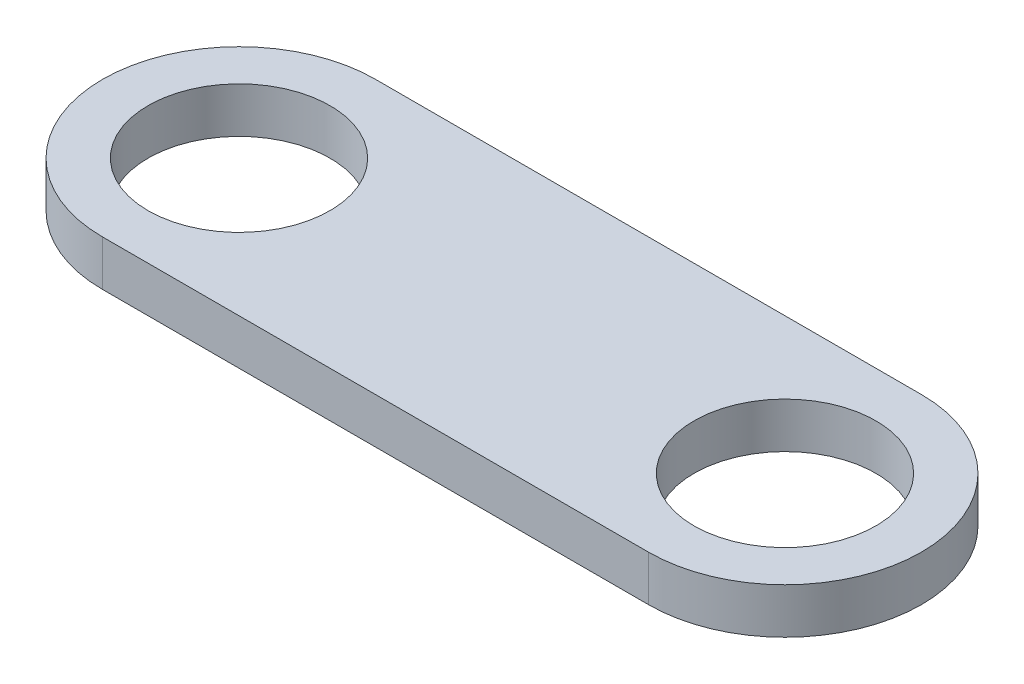
ISO-10303-21;
HEADER;
FILE_DESCRIPTION(('STEP AP214'),'2;1');
FILE_NAME('part.step','',(''),(''),'','','');
FILE_SCHEMA(('AUTOMOTIVE_DESIGN { 1 0 10303 214 1 1 1 1 }'));
ENDSEC;
DATA;
#1=APPLICATION_CONTEXT('core data for automotive mechanical design processes');
#2=APPLICATION_PROTOCOL_DEFINITION('international standard','automotive_design',2000,#1);
#3=PRODUCT_CONTEXT('',#1,'mechanical');
#4=PRODUCT('Part','Part','',(#3));
#5=PRODUCT_RELATED_PRODUCT_CATEGORY('part','',(#4));
#6=PRODUCT_DEFINITION_FORMATION('','',#4);
#7=PRODUCT_DEFINITION_CONTEXT('part definition',#1,'design');
#8=PRODUCT_DEFINITION('design','',#6,#7);
#9=PRODUCT_DEFINITION_SHAPE('','',#8);
#10=(LENGTH_UNIT() NAMED_UNIT(*) SI_UNIT(.MILLI.,.METRE.));
#11=(NAMED_UNIT(*) PLANE_ANGLE_UNIT() SI_UNIT($,.RADIAN.));
#12=(NAMED_UNIT(*) SI_UNIT($,.STERADIAN.) SOLID_ANGLE_UNIT());
#13=UNCERTAINTY_MEASURE_WITH_UNIT(LENGTH_MEASURE(1.E-05),#10,'distance_accuracy_value','');
#14=(GEOMETRIC_REPRESENTATION_CONTEXT(3) GLOBAL_UNCERTAINTY_ASSIGNED_CONTEXT((#13)) GLOBAL_UNIT_ASSIGNED_CONTEXT((#10,
#11,#12)) REPRESENTATION_CONTEXT('',''));
#15=CARTESIAN_POINT('',(0.,0.,0.));
#16=DIRECTION('',(0.,0.,1.));
#17=DIRECTION('',(1.,0.,0.));
#18=AXIS2_PLACEMENT_3D('',#15,#16,#17);
#19=CARTESIAN_POINT('',(0.,3.175,0.));
#20=DIRECTION('',(0.,1.,0.));
#21=DIRECTION('',(0.,0.,1.));
#22=AXIS2_PLACEMENT_3D('',#19,#20,#21);
#23=PLANE('',#22);
#24=CARTESIAN_POINT('',(0.,3.175,0.));
#25=DIRECTION('',(0.,1.,0.));
#26=DIRECTION('',(0.,0.,1.));
#27=AXIS2_PLACEMENT_3D('',#24,#25,#26);
#28=CIRCLE('',#27,6.35);
#29=CARTESIAN_POINT('',(0.,3.175,6.35));
#30=VERTEX_POINT('',#29);
#31=EDGE_CURVE('E100',#30,#30,#28,.T.);
#32=ORIENTED_EDGE('',*,*,#31,.F.);
#33=EDGE_LOOP('',(#32));
#34=FACE_BOUND('',#33,.T.);
#35=CARTESIAN_POINT('',(0.,3.175,0.));
#36=DIRECTION('',(0.,1.,0.));
#37=DIRECTION('',(0.,0.,1.));
#38=AXIS2_PLACEMENT_3D('',#35,#36,#37);
#39=CIRCLE('',#38,9.525);
#40=CARTESIAN_POINT('',(0.,3.175,-9.525));
#41=VERTEX_POINT('',#40);
#42=CARTESIAN_POINT('',(0.,3.175,9.525));
#43=VERTEX_POINT('',#42);
#44=EDGE_CURVE('E85',#41,#43,#39,.T.);
#45=ORIENTED_EDGE('',*,*,#44,.T.);
#46=DIRECTION('',(1.,0.,0.));
#47=VECTOR('',#46,1.);
#48=CARTESIAN_POINT('',(0.,3.175,9.525));
#49=LINE('',#48,#47);
#50=CARTESIAN_POINT('',(38.1,3.175,9.525));
#51=VERTEX_POINT('',#50);
#52=EDGE_CURVE('E80',#43,#51,#49,.T.);
#53=ORIENTED_EDGE('',*,*,#52,.T.);
#54=CARTESIAN_POINT('',(38.1,3.175,0.));
#55=DIRECTION('',(0.,1.,0.));
#56=DIRECTION('',(0.,0.,1.));
#57=AXIS2_PLACEMENT_3D('',#54,#55,#56);
#58=CIRCLE('',#57,9.525);
#59=CARTESIAN_POINT('',(38.1,3.175,-9.525));
#60=VERTEX_POINT('',#59);
#61=EDGE_CURVE('E83',#51,#60,#58,.T.);
#62=ORIENTED_EDGE('',*,*,#61,.T.);
#63=DIRECTION('',(-1.,0.,0.));
#64=VECTOR('',#63,1.);
#65=CARTESIAN_POINT('',(0.,3.175,-9.525));
#66=LINE('',#65,#64);
#67=EDGE_CURVE('E50',#60,#41,#66,.T.);
#68=ORIENTED_EDGE('',*,*,#67,.T.);
#69=EDGE_LOOP('',(#45,#53,#62,#68));
#70=FACE_BOUND('',#69,.T.);
#71=CARTESIAN_POINT('',(38.1,3.175,0.));
#72=DIRECTION('',(0.,1.,0.));
#73=DIRECTION('',(0.,0.,1.));
#74=AXIS2_PLACEMENT_3D('',#71,#72,#73);
#75=CIRCLE('',#74,6.35);
#76=CARTESIAN_POINT('',(38.1,3.175,6.35));
#77=VERTEX_POINT('',#76);
#78=EDGE_CURVE('E115',#77,#77,#75,.T.);
#79=ORIENTED_EDGE('',*,*,#78,.F.);
#80=EDGE_LOOP('',(#79));
#81=FACE_BOUND('',#80,.T.);
#82=ADVANCED_FACE('F33',(#34,#70,#81),#23,.T.);
#83=CARTESIAN_POINT('',(0.,0.,0.));
#84=DIRECTION('',(0.,1.,0.));
#85=DIRECTION('',(0.,0.,1.));
#86=AXIS2_PLACEMENT_3D('',#83,#84,#85);
#87=PLANE('',#86);
#88=CARTESIAN_POINT('',(0.,0.,0.));
#89=DIRECTION('',(0.,1.,0.));
#90=DIRECTION('',(0.,0.,1.));
#91=AXIS2_PLACEMENT_3D('',#88,#89,#90);
#92=CIRCLE('',#91,9.525);
#93=CARTESIAN_POINT('',(0.,0.,-9.525));
#94=VERTEX_POINT('',#93);
#95=CARTESIAN_POINT('',(0.,0.,9.525));
#96=VERTEX_POINT('',#95);
#97=EDGE_CURVE('E97',#94,#96,#92,.T.);
#98=ORIENTED_EDGE('',*,*,#97,.F.);
#99=DIRECTION('',(-1.,0.,0.));
#100=VECTOR('',#99,1.);
#101=CARTESIAN_POINT('',(0.,0.,-9.525));
#102=LINE('',#101,#100);
#103=CARTESIAN_POINT('',(38.1,0.,-9.525));
#104=VERTEX_POINT('',#103);
#105=EDGE_CURVE('E73',#104,#94,#102,.T.);
#106=ORIENTED_EDGE('',*,*,#105,.F.);
#107=CARTESIAN_POINT('',(38.1,0.,0.));
#108=DIRECTION('',(0.,1.,0.));
#109=DIRECTION('',(0.,0.,1.));
#110=AXIS2_PLACEMENT_3D('',#107,#108,#109);
#111=CIRCLE('',#110,9.525);
#112=CARTESIAN_POINT('',(38.1,0.,9.525));
#113=VERTEX_POINT('',#112);
#114=EDGE_CURVE('E67',#113,#104,#111,.T.);
#115=ORIENTED_EDGE('',*,*,#114,.F.);
#116=DIRECTION('',(1.,0.,0.));
#117=VECTOR('',#116,1.);
#118=CARTESIAN_POINT('',(0.,0.,9.525));
#119=LINE('',#118,#117);
#120=EDGE_CURVE('E89',#96,#113,#119,.T.);
#121=ORIENTED_EDGE('',*,*,#120,.F.);
#122=EDGE_LOOP('',(#98,#106,#115,#121));
#123=FACE_BOUND('',#122,.T.);
#124=CARTESIAN_POINT('',(0.,0.,0.));
#125=DIRECTION('',(0.,1.,0.));
#126=DIRECTION('',(0.,0.,1.));
#127=AXIS2_PLACEMENT_3D('',#124,#125,#126);
#128=CIRCLE('',#127,6.35);
#129=CARTESIAN_POINT('',(0.,0.,6.35));
#130=VERTEX_POINT('',#129);
#131=EDGE_CURVE('E112',#130,#130,#128,.T.);
#132=ORIENTED_EDGE('',*,*,#131,.T.);
#133=EDGE_LOOP('',(#132));
#134=FACE_BOUND('',#133,.T.);
#135=CARTESIAN_POINT('',(38.1,0.,0.));
#136=DIRECTION('',(0.,1.,0.));
#137=DIRECTION('',(0.,0.,1.));
#138=AXIS2_PLACEMENT_3D('',#135,#136,#137);
#139=CIRCLE('',#138,6.35);
#140=CARTESIAN_POINT('',(38.1,0.,6.35));
#141=VERTEX_POINT('',#140);
#142=EDGE_CURVE('E118',#141,#141,#139,.T.);
#143=ORIENTED_EDGE('',*,*,#142,.T.);
#144=EDGE_LOOP('',(#143));
#145=FACE_BOUND('',#144,.T.);
#146=ADVANCED_FACE('F108',(#123,#134,#145),#87,.F.);
#147=CARTESIAN_POINT('',(0.,3.175,0.));
#148=DIRECTION('',(0.,-1.,0.));
#149=DIRECTION('',(0.,0.,-1.));
#150=AXIS2_PLACEMENT_3D('',#147,#148,#149);
#151=CYLINDRICAL_SURFACE('',#150,9.525);
#152=ORIENTED_EDGE('',*,*,#97,.T.);
#153=DIRECTION('',(0.,-1.,0.));
#154=VECTOR('',#153,1.);
#155=CARTESIAN_POINT('',(0.,3.175,9.525));
#156=LINE('',#155,#154);
#157=EDGE_CURVE('E11',#43,#96,#156,.T.);
#158=ORIENTED_EDGE('',*,*,#157,.F.);
#159=ORIENTED_EDGE('',*,*,#44,.F.);
#160=DIRECTION('',(0.,-1.,0.));
#161=VECTOR('',#160,1.);
#162=CARTESIAN_POINT('',(0.,3.175,-9.525));
#163=LINE('',#162,#161);
#164=EDGE_CURVE('E93',#41,#94,#163,.T.);
#165=ORIENTED_EDGE('',*,*,#164,.T.);
#166=EDGE_LOOP('',(#152,#158,#159,#165));
#167=FACE_BOUND('',#166,.T.);
#168=ADVANCED_FACE('F35',(#167),#151,.T.);
#169=CARTESIAN_POINT('',(0.,3.175,9.525));
#170=DIRECTION('',(0.,0.,-1.));
#171=DIRECTION('',(-1.,0.,0.));
#172=AXIS2_PLACEMENT_3D('',#169,#170,#171);
#173=PLANE('',#172);
#174=ORIENTED_EDGE('',*,*,#120,.T.);
#175=DIRECTION('',(0.,-1.,0.));
#176=VECTOR('',#175,1.);
#177=CARTESIAN_POINT('',(38.1,3.175,9.525));
#178=LINE('',#177,#176);
#179=EDGE_CURVE('E42',#51,#113,#178,.T.);
#180=ORIENTED_EDGE('',*,*,#179,.F.);
#181=ORIENTED_EDGE('',*,*,#52,.F.);
#182=ORIENTED_EDGE('',*,*,#157,.T.);
#183=EDGE_LOOP('',(#174,#180,#181,#182));
#184=FACE_BOUND('',#183,.T.);
#185=ADVANCED_FACE('F88',(#184),#173,.F.);
#186=CARTESIAN_POINT('',(38.1,3.175,0.));
#187=DIRECTION('',(0.,-1.,0.));
#188=DIRECTION('',(0.,0.,-1.));
#189=AXIS2_PLACEMENT_3D('',#186,#187,#188);
#190=CYLINDRICAL_SURFACE('',#189,9.525);
#191=ORIENTED_EDGE('',*,*,#114,.T.);
#192=DIRECTION('',(0.,-1.,0.));
#193=VECTOR('',#192,1.);
#194=CARTESIAN_POINT('',(38.1,3.175,-9.525));
#195=LINE('',#194,#193);
#196=EDGE_CURVE('E90',#60,#104,#195,.T.);
#197=ORIENTED_EDGE('',*,*,#196,.F.);
#198=ORIENTED_EDGE('',*,*,#61,.F.);
#199=ORIENTED_EDGE('',*,*,#179,.T.);
#200=EDGE_LOOP('',(#191,#197,#198,#199));
#201=FACE_BOUND('',#200,.T.);
#202=ADVANCED_FACE('F91',(#201),#190,.T.);
#203=CARTESIAN_POINT('',(0.,3.175,-9.525));
#204=DIRECTION('',(0.,0.,1.));
#205=DIRECTION('',(1.,0.,0.));
#206=AXIS2_PLACEMENT_3D('',#203,#204,#205);
#207=PLANE('',#206);
#208=ORIENTED_EDGE('',*,*,#105,.T.);
#209=ORIENTED_EDGE('',*,*,#164,.F.);
#210=ORIENTED_EDGE('',*,*,#67,.F.);
#211=ORIENTED_EDGE('',*,*,#196,.T.);
#212=EDGE_LOOP('',(#208,#209,#210,#211));
#213=FACE_BOUND('',#212,.T.);
#214=ADVANCED_FACE('F105',(#213),#207,.F.);
#215=CARTESIAN_POINT('',(0.,3.175,0.));
#216=DIRECTION('',(0.,-1.,0.));
#217=DIRECTION('',(0.,0.,-1.));
#218=AXIS2_PLACEMENT_3D('',#215,#216,#217);
#219=CYLINDRICAL_SURFACE('',#218,6.35);
#220=ORIENTED_EDGE('',*,*,#31,.T.);
#221=EDGE_LOOP('',(#220));
#222=FACE_BOUND('',#221,.T.);
#223=ORIENTED_EDGE('',*,*,#131,.F.);
#224=EDGE_LOOP('',(#223));
#225=FACE_BOUND('',#224,.T.);
#226=ADVANCED_FACE('F135',(#222,#225),#219,.F.);
#227=CARTESIAN_POINT('',(38.1,3.175,0.));
#228=DIRECTION('',(0.,-1.,0.));
#229=DIRECTION('',(0.,0.,-1.));
#230=AXIS2_PLACEMENT_3D('',#227,#228,#229);
#231=CYLINDRICAL_SURFACE('',#230,6.35);
#232=ORIENTED_EDGE('',*,*,#78,.T.);
#233=EDGE_LOOP('',(#232));
#234=FACE_BOUND('',#233,.T.);
#235=ORIENTED_EDGE('',*,*,#142,.F.);
#236=EDGE_LOOP('',(#235));
#237=FACE_BOUND('',#236,.T.);
#238=ADVANCED_FACE('F124',(#234,#237),#231,.F.);
#239=CLOSED_SHELL('',(#82,#146,#168,#185,#202,#214,#226,#238));
#240=MANIFOLD_SOLID_BREP('B2',#239);
#241=ADVANCED_BREP_SHAPE_REPRESENTATION('',(#18,#240),#14);
#242=SHAPE_DEFINITION_REPRESENTATION(#9,#241);
ENDSEC;
END-ISO-10303-21;
